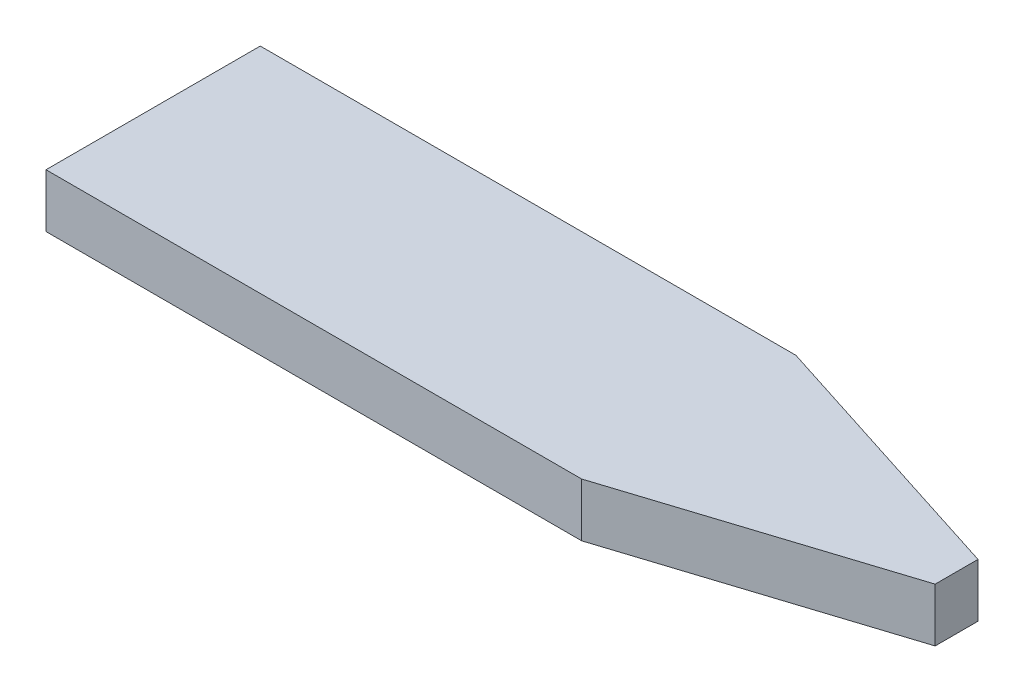
ISO-10303-21;
HEADER;
FILE_DESCRIPTION(('STEP AP214'),'2;1');
FILE_NAME('part.step','',(''),(''),'','','');
FILE_SCHEMA(('AUTOMOTIVE_DESIGN { 1 0 10303 214 1 1 1 1 }'));
ENDSEC;
DATA;
#1=APPLICATION_CONTEXT('core data for automotive mechanical design processes');
#2=APPLICATION_PROTOCOL_DEFINITION('international standard','automotive_design',2000,#1);
#3=PRODUCT_CONTEXT('',#1,'mechanical');
#4=PRODUCT('Part','Part','',(#3));
#5=PRODUCT_RELATED_PRODUCT_CATEGORY('part','',(#4));
#6=PRODUCT_DEFINITION_FORMATION('','',#4);
#7=PRODUCT_DEFINITION_CONTEXT('part definition',#1,'design');
#8=PRODUCT_DEFINITION('design','',#6,#7);
#9=PRODUCT_DEFINITION_SHAPE('','',#8);
#10=(LENGTH_UNIT() NAMED_UNIT(*) SI_UNIT(.MILLI.,.METRE.));
#11=(NAMED_UNIT(*) PLANE_ANGLE_UNIT() SI_UNIT($,.RADIAN.));
#12=(NAMED_UNIT(*) SI_UNIT($,.STERADIAN.) SOLID_ANGLE_UNIT());
#13=UNCERTAINTY_MEASURE_WITH_UNIT(LENGTH_MEASURE(1.E-05),#10,'distance_accuracy_value','');
#14=(GEOMETRIC_REPRESENTATION_CONTEXT(3) GLOBAL_UNCERTAINTY_ASSIGNED_CONTEXT((#13)) GLOBAL_UNIT_ASSIGNED_CONTEXT((#10,
#11,#12)) REPRESENTATION_CONTEXT('',''));
#15=CARTESIAN_POINT('',(0.,0.,0.));
#16=DIRECTION('',(0.,0.,1.));
#17=DIRECTION('',(1.,0.,0.));
#18=AXIS2_PLACEMENT_3D('',#15,#16,#17);
#19=CARTESIAN_POINT('',(0.,5.,-10.));
#20=DIRECTION('',(0.,0.,1.));
#21=DIRECTION('',(1.,0.,0.));
#22=AXIS2_PLACEMENT_3D('',#19,#20,#21);
#23=PLANE('',#22);
#24=DIRECTION('',(-1.,0.,0.));
#25=VECTOR('',#24,1.);
#26=CARTESIAN_POINT('',(0.,0.,-10.));
#27=LINE('',#26,#25);
#28=CARTESIAN_POINT('',(25.,0.,-10.));
#29=VERTEX_POINT('',#28);
#30=CARTESIAN_POINT('',(-25.,0.,-10.));
#31=VERTEX_POINT('',#30);
#32=EDGE_CURVE('E121',#29,#31,#27,.T.);
#33=ORIENTED_EDGE('',*,*,#32,.T.);
#34=DIRECTION('',(0.,-1.,0.));
#35=VECTOR('',#34,1.);
#36=CARTESIAN_POINT('',(-25.,5.,-10.));
#37=LINE('',#36,#35);
#38=CARTESIAN_POINT('',(-25.,5.,-10.));
#39=VERTEX_POINT('',#38);
#40=EDGE_CURVE('E11',#39,#31,#37,.T.);
#41=ORIENTED_EDGE('',*,*,#40,.F.);
#42=DIRECTION('',(-1.,0.,0.));
#43=VECTOR('',#42,1.);
#44=CARTESIAN_POINT('',(0.,5.,-10.));
#45=LINE('',#44,#43);
#46=CARTESIAN_POINT('',(25.,5.,-10.));
#47=VERTEX_POINT('',#46);
#48=EDGE_CURVE('E135',#47,#39,#45,.T.);
#49=ORIENTED_EDGE('',*,*,#48,.F.);
#50=DIRECTION('',(0.,-1.,0.));
#51=VECTOR('',#50,1.);
#52=CARTESIAN_POINT('',(25.,5.,-10.));
#53=LINE('',#52,#51);
#54=EDGE_CURVE('E53',#47,#29,#53,.T.);
#55=ORIENTED_EDGE('',*,*,#54,.T.);
#56=EDGE_LOOP('',(#33,#41,#49,#55));
#57=FACE_BOUND('',#56,.T.);
#58=ADVANCED_FACE('F37',(#57),#23,.F.);
#59=CARTESIAN_POINT('',(-25.,5.,0.));
#60=DIRECTION('',(1.,0.,0.));
#61=DIRECTION('',(0.,0.,-1.));
#62=AXIS2_PLACEMENT_3D('',#59,#60,#61);
#63=PLANE('',#62);
#64=DIRECTION('',(0.,0.,1.));
#65=VECTOR('',#64,1.);
#66=CARTESIAN_POINT('',(-25.,0.,0.));
#67=LINE('',#66,#65);
#68=CARTESIAN_POINT('',(-25.,0.,10.));
#69=VERTEX_POINT('',#68);
#70=EDGE_CURVE('E123',#31,#69,#67,.T.);
#71=ORIENTED_EDGE('',*,*,#70,.T.);
#72=DIRECTION('',(0.,-1.,0.));
#73=VECTOR('',#72,1.);
#74=CARTESIAN_POINT('',(-25.,5.,10.));
#75=LINE('',#74,#73);
#76=CARTESIAN_POINT('',(-25.,5.,10.));
#77=VERTEX_POINT('',#76);
#78=EDGE_CURVE('E45',#77,#69,#75,.T.);
#79=ORIENTED_EDGE('',*,*,#78,.F.);
#80=DIRECTION('',(0.,0.,1.));
#81=VECTOR('',#80,1.);
#82=CARTESIAN_POINT('',(-25.,5.,0.));
#83=LINE('',#82,#81);
#84=EDGE_CURVE('E85',#39,#77,#83,.T.);
#85=ORIENTED_EDGE('',*,*,#84,.F.);
#86=ORIENTED_EDGE('',*,*,#40,.T.);
#87=EDGE_LOOP('',(#71,#79,#85,#86));
#88=FACE_BOUND('',#87,.T.);
#89=ADVANCED_FACE('F141',(#88),#63,.F.);
#90=CARTESIAN_POINT('',(0.,5.,10.));
#91=DIRECTION('',(0.,0.,1.));
#92=DIRECTION('',(1.,0.,0.));
#93=AXIS2_PLACEMENT_3D('',#90,#91,#92);
#94=PLANE('',#93);
#95=DIRECTION('',(-1.,0.,0.));
#96=VECTOR('',#95,1.);
#97=CARTESIAN_POINT('',(0.,0.,10.));
#98=LINE('',#97,#96);
#99=CARTESIAN_POINT('',(25.,0.,10.));
#100=VERTEX_POINT('',#99);
#101=EDGE_CURVE('E126',#100,#69,#98,.T.);
#102=ORIENTED_EDGE('',*,*,#101,.F.);
#103=DIRECTION('',(0.,-1.,0.));
#104=VECTOR('',#103,1.);
#105=CARTESIAN_POINT('',(25.,5.,10.));
#106=LINE('',#105,#104);
#107=CARTESIAN_POINT('',(25.,5.,10.));
#108=VERTEX_POINT('',#107);
#109=EDGE_CURVE('E104',#108,#100,#106,.T.);
#110=ORIENTED_EDGE('',*,*,#109,.F.);
#111=DIRECTION('',(-1.,0.,0.));
#112=VECTOR('',#111,1.);
#113=CARTESIAN_POINT('',(0.,5.,10.));
#114=LINE('',#113,#112);
#115=EDGE_CURVE('E113',#108,#77,#114,.T.);
#116=ORIENTED_EDGE('',*,*,#115,.T.);
#117=ORIENTED_EDGE('',*,*,#78,.T.);
#118=EDGE_LOOP('',(#102,#110,#116,#117));
#119=FACE_BOUND('',#118,.T.);
#120=ADVANCED_FACE('F140',(#119),#94,.T.);
#121=CARTESIAN_POINT('',(5.22496371552975,5.,16.3280116110305));
#122=DIRECTION('',(0.304775727103784,0.,0.952424147199324));
#123=DIRECTION('',(0.952424147199324,0.,-0.304775727103784));
#124=AXIS2_PLACEMENT_3D('',#121,#122,#123);
#125=PLANE('',#124);
#126=DIRECTION('',(-0.952424147199324,0.,0.304775727103784));
#127=VECTOR('',#126,1.);
#128=CARTESIAN_POINT('',(5.22496371552975,0.,16.3280116110305));
#129=LINE('',#128,#127);
#130=CARTESIAN_POINT('',(50.,0.,2.));
#131=VERTEX_POINT('',#130);
#132=EDGE_CURVE('E100',#131,#100,#129,.T.);
#133=ORIENTED_EDGE('',*,*,#132,.F.);
#134=DIRECTION('',(0.,-1.,0.));
#135=VECTOR('',#134,1.);
#136=CARTESIAN_POINT('',(50.,5.,2.));
#137=LINE('',#136,#135);
#138=CARTESIAN_POINT('',(50.,5.,2.));
#139=VERTEX_POINT('',#138);
#140=EDGE_CURVE('E95',#139,#131,#137,.T.);
#141=ORIENTED_EDGE('',*,*,#140,.F.);
#142=DIRECTION('',(-0.952424147199324,0.,0.304775727103784));
#143=VECTOR('',#142,1.);
#144=CARTESIAN_POINT('',(5.22496371552975,5.,16.3280116110305));
#145=LINE('',#144,#143);
#146=EDGE_CURVE('E98',#139,#108,#145,.T.);
#147=ORIENTED_EDGE('',*,*,#146,.T.);
#148=ORIENTED_EDGE('',*,*,#109,.T.);
#149=EDGE_LOOP('',(#133,#141,#147,#148));
#150=FACE_BOUND('',#149,.T.);
#151=ADVANCED_FACE('F97',(#150),#125,.T.);
#152=CARTESIAN_POINT('',(50.,5.,-1.73472347597681E-13));
#153=DIRECTION('',(1.,0.,0.));
#154=DIRECTION('',(0.,0.,-1.));
#155=AXIS2_PLACEMENT_3D('',#152,#153,#154);
#156=PLANE('',#155);
#157=DIRECTION('',(0.,0.,1.));
#158=VECTOR('',#157,1.);
#159=CARTESIAN_POINT('',(50.,0.,-1.73472347597681E-13));
#160=LINE('',#159,#158);
#161=CARTESIAN_POINT('',(50.,0.,-2.));
#162=VERTEX_POINT('',#161);
#163=EDGE_CURVE('E130',#162,#131,#160,.T.);
#164=ORIENTED_EDGE('',*,*,#163,.F.);
#165=DIRECTION('',(0.,-1.,0.));
#166=VECTOR('',#165,1.);
#167=CARTESIAN_POINT('',(50.,5.,-2.));
#168=LINE('',#167,#166);
#169=CARTESIAN_POINT('',(50.,5.,-2.));
#170=VERTEX_POINT('',#169);
#171=EDGE_CURVE('E73',#170,#162,#168,.T.);
#172=ORIENTED_EDGE('',*,*,#171,.F.);
#173=DIRECTION('',(0.,0.,1.));
#174=VECTOR('',#173,1.);
#175=CARTESIAN_POINT('',(50.,5.,-1.73472347597681E-13));
#176=LINE('',#175,#174);
#177=EDGE_CURVE('E111',#170,#139,#176,.T.);
#178=ORIENTED_EDGE('',*,*,#177,.T.);
#179=ORIENTED_EDGE('',*,*,#140,.T.);
#180=EDGE_LOOP('',(#164,#172,#178,#179));
#181=FACE_BOUND('',#180,.T.);
#182=ADVANCED_FACE('F115',(#181),#156,.T.);
#183=CARTESIAN_POINT('',(5.22496371552975,5.,-16.3280116110305));
#184=DIRECTION('',(0.304775727103784,0.,-0.952424147199324));
#185=DIRECTION('',(-0.952424147199324,0.,-0.304775727103784));
#186=AXIS2_PLACEMENT_3D('',#183,#184,#185);
#187=PLANE('',#186);
#188=DIRECTION('',(0.952424147199324,0.,0.304775727103784));
#189=VECTOR('',#188,1.);
#190=CARTESIAN_POINT('',(5.22496371552975,0.,-16.3280116110305));
#191=LINE('',#190,#189);
#192=EDGE_CURVE('E132',#29,#162,#191,.T.);
#193=ORIENTED_EDGE('',*,*,#192,.F.);
#194=ORIENTED_EDGE('',*,*,#54,.F.);
#195=DIRECTION('',(0.952424147199324,0.,0.304775727103784));
#196=VECTOR('',#195,1.);
#197=CARTESIAN_POINT('',(5.22496371552975,5.,-16.3280116110305));
#198=LINE('',#197,#196);
#199=EDGE_CURVE('E116',#47,#170,#198,.T.);
#200=ORIENTED_EDGE('',*,*,#199,.T.);
#201=ORIENTED_EDGE('',*,*,#171,.T.);
#202=EDGE_LOOP('',(#193,#194,#200,#201));
#203=FACE_BOUND('',#202,.T.);
#204=ADVANCED_FACE('F145',(#203),#187,.T.);
#205=CARTESIAN_POINT('',(0.,5.,0.));
#206=DIRECTION('',(0.,1.,0.));
#207=DIRECTION('',(0.,0.,1.));
#208=AXIS2_PLACEMENT_3D('',#205,#206,#207);
#209=PLANE('',#208);
#210=ORIENTED_EDGE('',*,*,#48,.T.);
#211=ORIENTED_EDGE('',*,*,#84,.T.);
#212=ORIENTED_EDGE('',*,*,#115,.F.);
#213=ORIENTED_EDGE('',*,*,#146,.F.);
#214=ORIENTED_EDGE('',*,*,#177,.F.);
#215=ORIENTED_EDGE('',*,*,#199,.F.);
#216=EDGE_LOOP('',(#210,#211,#212,#213,#214,#215));
#217=FACE_BOUND('',#216,.T.);
#218=ADVANCED_FACE('F109',(#217),#209,.T.);
#219=CARTESIAN_POINT('',(0.,0.,0.));
#220=DIRECTION('',(0.,1.,0.));
#221=DIRECTION('',(0.,0.,1.));
#222=AXIS2_PLACEMENT_3D('',#219,#220,#221);
#223=PLANE('',#222);
#224=ORIENTED_EDGE('',*,*,#32,.F.);
#225=ORIENTED_EDGE('',*,*,#192,.T.);
#226=ORIENTED_EDGE('',*,*,#163,.T.);
#227=ORIENTED_EDGE('',*,*,#132,.T.);
#228=ORIENTED_EDGE('',*,*,#101,.T.);
#229=ORIENTED_EDGE('',*,*,#70,.F.);
#230=EDGE_LOOP('',(#224,#225,#226,#227,#228,#229));
#231=FACE_BOUND('',#230,.T.);
#232=ADVANCED_FACE('F144',(#231),#223,.F.);
#233=CLOSED_SHELL('',(#58,#89,#120,#151,#182,#204,#218,#232));
#234=MANIFOLD_SOLID_BREP('B2',#233);
#235=ADVANCED_BREP_SHAPE_REPRESENTATION('',(#18,#234),#14);
#236=SHAPE_DEFINITION_REPRESENTATION(#9,#235);
ENDSEC;
END-ISO-10303-21;
